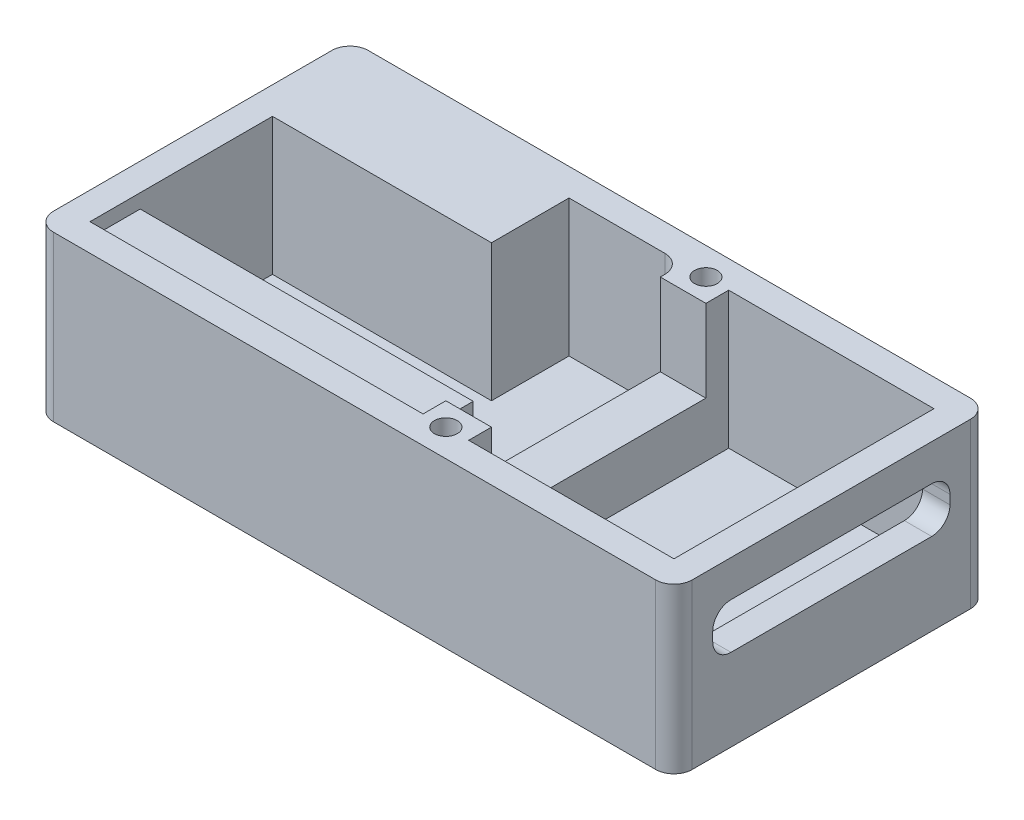
ISO-10303-21;
HEADER;
FILE_DESCRIPTION(('STEP AP214'),'2;1');
FILE_NAME('part.step','',(''),(''),'','','');
FILE_SCHEMA(('AUTOMOTIVE_DESIGN { 1 0 10303 214 1 1 1 1 }'));
ENDSEC;
DATA;
#1=APPLICATION_CONTEXT('core data for automotive mechanical design processes');
#2=APPLICATION_PROTOCOL_DEFINITION('international standard','automotive_design',2000,#1);
#3=PRODUCT_CONTEXT('',#1,'mechanical');
#4=PRODUCT('Part','Part','',(#3));
#5=PRODUCT_RELATED_PRODUCT_CATEGORY('part','',(#4));
#6=PRODUCT_DEFINITION_FORMATION('','',#4);
#7=PRODUCT_DEFINITION_CONTEXT('part definition',#1,'design');
#8=PRODUCT_DEFINITION('design','',#6,#7);
#9=PRODUCT_DEFINITION_SHAPE('','',#8);
#10=(LENGTH_UNIT() NAMED_UNIT(*) SI_UNIT(.MILLI.,.METRE.));
#11=(NAMED_UNIT(*) PLANE_ANGLE_UNIT() SI_UNIT($,.RADIAN.));
#12=(NAMED_UNIT(*) SI_UNIT($,.STERADIAN.) SOLID_ANGLE_UNIT());
#13=UNCERTAINTY_MEASURE_WITH_UNIT(LENGTH_MEASURE(1.E-05),#10,'distance_accuracy_value','');
#14=(GEOMETRIC_REPRESENTATION_CONTEXT(3) GLOBAL_UNCERTAINTY_ASSIGNED_CONTEXT((#13)) GLOBAL_UNIT_ASSIGNED_CONTEXT((#10,
#11,#12)) REPRESENTATION_CONTEXT('',''));
#15=CARTESIAN_POINT('',(0.,0.,0.));
#16=DIRECTION('',(0.,0.,1.));
#17=DIRECTION('',(1.,0.,0.));
#18=AXIS2_PLACEMENT_3D('',#15,#16,#17);
#19=CARTESIAN_POINT('',(4.5,46.9352725924606,-14.25));
#20=DIRECTION('',(1.,0.,0.));
#21=DIRECTION('',(0.,0.,-1.));
#22=AXIS2_PLACEMENT_3D('',#19,#20,#21);
#23=PLANE('',#22);
#24=DIRECTION('',(0.,0.,1.));
#25=VECTOR('',#24,1.);
#26=CARTESIAN_POINT('',(4.5,18.,-14.25));
#27=LINE('',#26,#25);
#28=CARTESIAN_POINT('',(4.5,18.,11.75));
#29=VERTEX_POINT('',#28);
#30=CARTESIAN_POINT('',(4.5,18.,14.25));
#31=VERTEX_POINT('',#30);
#32=EDGE_CURVE('E371',#29,#31,#27,.T.);
#33=ORIENTED_EDGE('',*,*,#32,.F.);
#34=DIRECTION('',(0.,1.,0.));
#35=VECTOR('',#34,1.);
#36=CARTESIAN_POINT('',(4.5,-15.0260275534679,11.75));
#37=LINE('',#36,#35);
#38=CARTESIAN_POINT('',(4.5,16.45,11.75));
#39=VERTEX_POINT('',#38);
#40=EDGE_CURVE('E318',#39,#29,#37,.T.);
#41=ORIENTED_EDGE('',*,*,#40,.F.);
#42=DIRECTION('',(0.,0.,-1.));
#43=VECTOR('',#42,1.);
#44=CARTESIAN_POINT('',(4.5,16.45,14.25));
#45=LINE('',#44,#43);
#46=CARTESIAN_POINT('',(4.5,16.45,14.25));
#47=VERTEX_POINT('',#46);
#48=EDGE_CURVE('E323',#47,#39,#45,.T.);
#49=ORIENTED_EDGE('',*,*,#48,.F.);
#50=DIRECTION('',(0.,-1.,0.));
#51=VECTOR('',#50,1.);
#52=CARTESIAN_POINT('',(4.5,46.9352725924606,14.25));
#53=LINE('',#52,#51);
#54=EDGE_CURVE('E367',#31,#47,#53,.T.);
#55=ORIENTED_EDGE('',*,*,#54,.F.);
#56=EDGE_LOOP('',(#33,#41,#49,#55));
#57=FACE_BOUND('',#56,.T.);
#58=ADVANCED_FACE('F61',(#57),#23,.F.);
#59=CARTESIAN_POINT('',(0.,3.,0.));
#60=DIRECTION('',(0.,-1.,0.));
#61=DIRECTION('',(0.,0.,-1.));
#62=AXIS2_PLACEMENT_3D('',#59,#60,#61);
#63=PLANE('',#62);
#64=DIRECTION('',(0.,0.,1.));
#65=VECTOR('',#64,1.);
#66=CARTESIAN_POINT('',(4.5,3.,-14.25));
#67=LINE('',#66,#65);
#68=CARTESIAN_POINT('',(4.5,3.,-12.25));
#69=VERTEX_POINT('',#68);
#70=CARTESIAN_POINT('',(4.5,3.,8.75));
#71=VERTEX_POINT('',#70);
#72=EDGE_CURVE('E365',#69,#71,#67,.T.);
#73=ORIENTED_EDGE('',*,*,#72,.F.);
#74=CARTESIAN_POINT('',(2.5,3.,-12.25));
#75=DIRECTION('',(0.,-1.,0.));
#76=DIRECTION('',(0.,0.,-1.));
#77=AXIS2_PLACEMENT_3D('',#74,#75,#76);
#78=CIRCLE('',#77,2.);
#79=CARTESIAN_POINT('',(2.5,3.,-14.25));
#80=VERTEX_POINT('',#79);
#81=EDGE_CURVE('E83',#69,#80,#78,.F.);
#82=ORIENTED_EDGE('',*,*,#81,.T.);
#83=DIRECTION('',(-1.,0.,0.));
#84=VECTOR('',#83,1.);
#85=CARTESIAN_POINT('',(35.,3.,-14.25));
#86=LINE('',#85,#84);
#87=CARTESIAN_POINT('',(-8.,3.,-14.25));
#88=VERTEX_POINT('',#87);
#89=EDGE_CURVE('E421',#80,#88,#86,.T.);
#90=ORIENTED_EDGE('',*,*,#89,.T.);
#91=DIRECTION('',(0.,0.,-1.));
#92=VECTOR('',#91,1.);
#93=CARTESIAN_POINT('',(-8.,3.,-14.25));
#94=LINE('',#93,#92);
#95=CARTESIAN_POINT('',(-8.,3.,-5.75));
#96=VERTEX_POINT('',#95);
#97=EDGE_CURVE('E339',#96,#88,#94,.T.);
#98=ORIENTED_EDGE('',*,*,#97,.F.);
#99=DIRECTION('',(1.,0.,0.));
#100=VECTOR('',#99,1.);
#101=CARTESIAN_POINT('',(-32.,3.,-5.75));
#102=LINE('',#101,#100);
#103=CARTESIAN_POINT('',(-32.,3.,-5.75));
#104=VERTEX_POINT('',#103);
#105=EDGE_CURVE('E344',#104,#96,#102,.T.);
#106=ORIENTED_EDGE('',*,*,#105,.F.);
#107=DIRECTION('',(0.,0.,1.));
#108=VECTOR('',#107,1.);
#109=CARTESIAN_POINT('',(-32.,3.,-17.25));
#110=LINE('',#109,#108);
#111=CARTESIAN_POINT('',(-32.,3.,8.75));
#112=VERTEX_POINT('',#111);
#113=EDGE_CURVE('E424',#104,#112,#110,.T.);
#114=ORIENTED_EDGE('',*,*,#113,.T.);
#115=DIRECTION('',(-1.,0.,0.));
#116=VECTOR('',#115,1.);
#117=CARTESIAN_POINT('',(-32.,3.,8.75));
#118=LINE('',#117,#116);
#119=EDGE_CURVE('E319',#71,#112,#118,.T.);
#120=ORIENTED_EDGE('',*,*,#119,.F.);
#121=EDGE_LOOP('',(#73,#82,#90,#98,#106,#114,#120));
#122=FACE_BOUND('',#121,.T.);
#123=ADVANCED_FACE('F542',(#122),#63,.F.);
#124=CARTESIAN_POINT('',(-32.,18.,-17.25));
#125=DIRECTION('',(1.,0.,0.));
#126=DIRECTION('',(0.,0.,-1.));
#127=AXIS2_PLACEMENT_3D('',#124,#125,#126);
#128=PLANE('',#127);
#129=DIRECTION('',(0.,0.,1.));
#130=VECTOR('',#129,1.);
#131=CARTESIAN_POINT('',(-32.,16.45,14.25));
#132=LINE('',#131,#130);
#133=CARTESIAN_POINT('',(-32.,16.45,8.75));
#134=VERTEX_POINT('',#133);
#135=CARTESIAN_POINT('',(-32.,16.45,14.25));
#136=VERTEX_POINT('',#135);
#137=EDGE_CURVE('E330',#134,#136,#132,.T.);
#138=ORIENTED_EDGE('',*,*,#137,.F.);
#139=DIRECTION('',(0.,-1.,0.));
#140=VECTOR('',#139,1.);
#141=CARTESIAN_POINT('',(-32.,54.9120576505835,8.75));
#142=LINE('',#141,#140);
#143=EDGE_CURVE('E317',#134,#112,#142,.T.);
#144=ORIENTED_EDGE('',*,*,#143,.T.);
#145=ORIENTED_EDGE('',*,*,#113,.F.);
#146=DIRECTION('',(0.,-1.,0.));
#147=VECTOR('',#146,1.);
#148=CARTESIAN_POINT('',(-32.,43.460754112948,-5.75));
#149=LINE('',#148,#147);
#150=CARTESIAN_POINT('',(-32.,18.,-5.75));
#151=VERTEX_POINT('',#150);
#152=EDGE_CURVE('E326',#151,#104,#149,.T.);
#153=ORIENTED_EDGE('',*,*,#152,.F.);
#154=DIRECTION('',(0.,0.,1.));
#155=VECTOR('',#154,1.);
#156=CARTESIAN_POINT('',(-32.,18.,-17.25));
#157=LINE('',#156,#155);
#158=CARTESIAN_POINT('',(-32.,18.,14.25));
#159=VERTEX_POINT('',#158);
#160=EDGE_CURVE('E414',#151,#159,#157,.T.);
#161=ORIENTED_EDGE('',*,*,#160,.T.);
#162=DIRECTION('',(0.,-1.,0.));
#163=VECTOR('',#162,1.);
#164=CARTESIAN_POINT('',(-32.,18.,14.25));
#165=LINE('',#164,#163);
#166=EDGE_CURVE('E416',#159,#136,#165,.T.);
#167=ORIENTED_EDGE('',*,*,#166,.T.);
#168=EDGE_LOOP('',(#138,#144,#145,#153,#161,#167));
#169=FACE_BOUND('',#168,.T.);
#170=ADVANCED_FACE('F549',(#169),#128,.T.);
#171=CARTESIAN_POINT('',(4.5,18.,-12.25));
#172=VERTEX_POINT('',#171);
#173=CARTESIAN_POINT('',(4.5,18.,-11.75));
#174=VERTEX_POINT('',#173);
#175=EDGE_CURVE('E368',#172,#174,#27,.T.);
#176=ORIENTED_EDGE('',*,*,#175,.F.);
#177=DIRECTION('',(0.,-1.,0.));
#178=VECTOR('',#177,1.);
#179=CARTESIAN_POINT('',(4.5,46.9352725924606,-12.25));
#180=LINE('',#179,#178);
#181=EDGE_CURVE('E530',#172,#69,#180,.T.);
#182=ORIENTED_EDGE('',*,*,#181,.T.);
#183=ORIENTED_EDGE('',*,*,#72,.T.);
#184=DIRECTION('',(0.,-1.,0.));
#185=VECTOR('',#184,1.);
#186=CARTESIAN_POINT('',(4.5,54.9120576505835,8.75));
#187=LINE('',#186,#185);
#188=CARTESIAN_POINT('',(4.5,9.,8.75));
#189=VERTEX_POINT('',#188);
#190=EDGE_CURVE('E336',#189,#71,#187,.T.);
#191=ORIENTED_EDGE('',*,*,#190,.F.);
#192=DIRECTION('',(0.,0.,1.));
#193=VECTOR('',#192,1.);
#194=CARTESIAN_POINT('',(4.5,9.,-11.75));
#195=LINE('',#194,#193);
#196=CARTESIAN_POINT('',(4.5,9.,-11.75));
#197=VERTEX_POINT('',#196);
#198=EDGE_CURVE('E566',#197,#189,#195,.T.);
#199=ORIENTED_EDGE('',*,*,#198,.F.);
#200=DIRECTION('',(0.,1.,0.));
#201=VECTOR('',#200,1.);
#202=CARTESIAN_POINT('',(4.5,-15.0260275534679,-11.75));
#203=LINE('',#202,#201);
#204=EDGE_CURVE('E312',#197,#174,#203,.T.);
#205=ORIENTED_EDGE('',*,*,#204,.T.);
#206=EDGE_LOOP('',(#176,#182,#183,#191,#199,#205));
#207=FACE_BOUND('',#206,.T.);
#208=ADVANCED_FACE('F536',(#207),#23,.F.);
#209=CARTESIAN_POINT('',(35.,18.,-14.25));
#210=DIRECTION('',(0.,0.,1.));
#211=DIRECTION('',(1.,0.,0.));
#212=AXIS2_PLACEMENT_3D('',#209,#210,#211);
#213=PLANE('',#212);
#214=ORIENTED_EDGE('',*,*,#89,.F.);
#215=DIRECTION('',(0.,-1.,0.));
#216=VECTOR('',#215,1.);
#217=CARTESIAN_POINT('',(2.5,18.,-14.25));
#218=LINE('',#217,#216);
#219=CARTESIAN_POINT('',(2.5,18.,-14.25));
#220=VERTEX_POINT('',#219);
#221=EDGE_CURVE('E69',#80,#220,#218,.F.);
#222=ORIENTED_EDGE('',*,*,#221,.T.);
#223=DIRECTION('',(-1.,0.,0.));
#224=VECTOR('',#223,1.);
#225=CARTESIAN_POINT('',(35.,18.,-14.25));
#226=LINE('',#225,#224);
#227=CARTESIAN_POINT('',(-8.,18.,-14.25));
#228=VERTEX_POINT('',#227);
#229=EDGE_CURVE('E410',#220,#228,#226,.T.);
#230=ORIENTED_EDGE('',*,*,#229,.T.);
#231=DIRECTION('',(0.,-1.,0.));
#232=VECTOR('',#231,1.);
#233=CARTESIAN_POINT('',(-8.,43.460754112948,-14.25));
#234=LINE('',#233,#232);
#235=EDGE_CURVE('E342',#228,#88,#234,.T.);
#236=ORIENTED_EDGE('',*,*,#235,.T.);
#237=EDGE_LOOP('',(#214,#222,#230,#236));
#238=FACE_BOUND('',#237,.T.);
#239=ADVANCED_FACE('F662',(#238),#213,.T.);
#240=CARTESIAN_POINT('',(-35.,18.,14.25));
#241=DIRECTION('',(0.,0.,-1.));
#242=DIRECTION('',(-1.,0.,0.));
#243=AXIS2_PLACEMENT_3D('',#240,#241,#242);
#244=PLANE('',#243);
#245=DIRECTION('',(1.,0.,0.));
#246=VECTOR('',#245,1.);
#247=CARTESIAN_POINT('',(-32.,16.45,14.25));
#248=LINE('',#247,#246);
#249=EDGE_CURVE('E328',#136,#47,#248,.T.);
#250=ORIENTED_EDGE('',*,*,#249,.F.);
#251=ORIENTED_EDGE('',*,*,#166,.F.);
#252=DIRECTION('',(1.,0.,0.));
#253=VECTOR('',#252,1.);
#254=CARTESIAN_POINT('',(-35.,18.,14.25));
#255=LINE('',#254,#253);
#256=EDGE_CURVE('E404',#159,#31,#255,.T.);
#257=ORIENTED_EDGE('',*,*,#256,.T.);
#258=ORIENTED_EDGE('',*,*,#54,.T.);
#259=EDGE_LOOP('',(#250,#251,#257,#258));
#260=FACE_BOUND('',#259,.T.);
#261=ADVANCED_FACE('F558',(#260),#244,.T.);
#262=DIRECTION('',(1.,0.,0.));
#263=VECTOR('',#262,1.);
#264=CARTESIAN_POINT('',(-35.,3.,14.25));
#265=LINE('',#264,#263);
#266=CARTESIAN_POINT('',(9.5,3.,14.25));
#267=VERTEX_POINT('',#266);
#268=CARTESIAN_POINT('',(32.,3.,14.25));
#269=VERTEX_POINT('',#268);
#270=EDGE_CURVE('E388',#267,#269,#265,.T.);
#271=ORIENTED_EDGE('',*,*,#270,.F.);
#272=DIRECTION('',(0.,-1.,0.));
#273=VECTOR('',#272,1.);
#274=CARTESIAN_POINT('',(9.5,46.9352725924606,14.25));
#275=LINE('',#274,#273);
#276=CARTESIAN_POINT('',(9.5,18.,14.25));
#277=VERTEX_POINT('',#276);
#278=EDGE_CURVE('E364',#277,#267,#275,.T.);
#279=ORIENTED_EDGE('',*,*,#278,.F.);
#280=CARTESIAN_POINT('',(32.,18.,14.25));
#281=VERTEX_POINT('',#280);
#282=EDGE_CURVE('E408',#277,#281,#255,.T.);
#283=ORIENTED_EDGE('',*,*,#282,.T.);
#284=DIRECTION('',(0.,-1.,0.));
#285=VECTOR('',#284,1.);
#286=CARTESIAN_POINT('',(32.,18.,14.25));
#287=LINE('',#286,#285);
#288=EDGE_CURVE('E431',#281,#269,#287,.T.);
#289=ORIENTED_EDGE('',*,*,#288,.T.);
#290=EDGE_LOOP('',(#271,#279,#283,#289));
#291=FACE_BOUND('',#290,.T.);
#292=ADVANCED_FACE('F679',(#291),#244,.T.);
#293=CARTESIAN_POINT('',(32.,18.,-14.25));
#294=VERTEX_POINT('',#293);
#295=CARTESIAN_POINT('',(9.5,18.,-14.25));
#296=VERTEX_POINT('',#295);
#297=EDGE_CURVE('E411',#294,#296,#226,.T.);
#298=ORIENTED_EDGE('',*,*,#297,.T.);
#299=DIRECTION('',(0.,-1.,0.));
#300=VECTOR('',#299,1.);
#301=CARTESIAN_POINT('',(9.5,46.9352725924606,-14.25));
#302=LINE('',#301,#300);
#303=CARTESIAN_POINT('',(9.5,3.,-14.25));
#304=VERTEX_POINT('',#303);
#305=EDGE_CURVE('E350',#296,#304,#302,.T.);
#306=ORIENTED_EDGE('',*,*,#305,.T.);
#307=CARTESIAN_POINT('',(32.,3.,-14.25));
#308=VERTEX_POINT('',#307);
#309=EDGE_CURVE('E422',#308,#304,#86,.T.);
#310=ORIENTED_EDGE('',*,*,#309,.F.);
#311=DIRECTION('',(0.,-1.,0.));
#312=VECTOR('',#311,1.);
#313=CARTESIAN_POINT('',(32.,18.,-14.25));
#314=LINE('',#313,#312);
#315=EDGE_CURVE('E429',#294,#308,#314,.T.);
#316=ORIENTED_EDGE('',*,*,#315,.F.);
#317=EDGE_LOOP('',(#298,#306,#310,#316));
#318=FACE_BOUND('',#317,.T.);
#319=ADVANCED_FACE('F649',(#318),#213,.T.);
#320=DIRECTION('',(0.,0.,-1.));
#321=VECTOR('',#320,1.);
#322=CARTESIAN_POINT('',(9.5,3.,14.25));
#323=LINE('',#322,#321);
#324=EDGE_CURVE('E360',#267,#304,#323,.T.);
#325=ORIENTED_EDGE('',*,*,#324,.F.);
#326=ORIENTED_EDGE('',*,*,#270,.T.);
#327=DIRECTION('',(0.,0.,-1.));
#328=VECTOR('',#327,1.);
#329=CARTESIAN_POINT('',(32.,3.,17.25));
#330=LINE('',#329,#328);
#331=EDGE_CURVE('E418',#269,#308,#330,.T.);
#332=ORIENTED_EDGE('',*,*,#331,.T.);
#333=ORIENTED_EDGE('',*,*,#309,.T.);
#334=EDGE_LOOP('',(#325,#326,#332,#333));
#335=FACE_BOUND('',#334,.T.);
#336=ADVANCED_FACE('F641',(#335),#63,.F.);
#337=CARTESIAN_POINT('',(35.,3.,17.25));
#338=DIRECTION('',(-1.,0.,0.));
#339=DIRECTION('',(0.,0.,1.));
#340=AXIS2_PLACEMENT_3D('',#337,#338,#339);
#341=PLANE('',#340);
#342=DIRECTION('',(0.,0.,-1.));
#343=VECTOR('',#342,1.);
#344=CARTESIAN_POINT('',(35.,9.,13.));
#345=LINE('',#344,#343);
#346=CARTESIAN_POINT('',(35.,9.,11.));
#347=VERTEX_POINT('',#346);
#348=CARTESIAN_POINT('',(35.,9.,-11.));
#349=VERTEX_POINT('',#348);
#350=EDGE_CURVE('E392',#347,#349,#345,.T.);
#351=ORIENTED_EDGE('',*,*,#350,.F.);
#352=CARTESIAN_POINT('',(35.,11.,11.));
#353=DIRECTION('',(-1.,0.,0.));
#354=DIRECTION('',(0.,0.,1.));
#355=AXIS2_PLACEMENT_3D('',#352,#353,#354);
#356=CIRCLE('',#355,2.);
#357=CARTESIAN_POINT('',(35.,11.,13.));
#358=VERTEX_POINT('',#357);
#359=EDGE_CURVE('E478',#347,#358,#356,.T.);
#360=ORIENTED_EDGE('',*,*,#359,.T.);
#361=DIRECTION('',(0.,-1.,0.));
#362=VECTOR('',#361,1.);
#363=CARTESIAN_POINT('',(35.,9.,13.));
#364=LINE('',#363,#362);
#365=CARTESIAN_POINT('',(35.,12.,13.));
#366=VERTEX_POINT('',#365);
#367=EDGE_CURVE('E383',#366,#358,#364,.T.);
#368=ORIENTED_EDGE('',*,*,#367,.F.);
#369=CARTESIAN_POINT('',(35.,12.,11.));
#370=DIRECTION('',(-1.,0.,0.));
#371=DIRECTION('',(0.,0.,1.));
#372=AXIS2_PLACEMENT_3D('',#369,#370,#371);
#373=CIRCLE('',#372,2.);
#374=CARTESIAN_POINT('',(35.,14.,11.));
#375=VERTEX_POINT('',#374);
#376=EDGE_CURVE('E482',#366,#375,#373,.T.);
#377=ORIENTED_EDGE('',*,*,#376,.T.);
#378=DIRECTION('',(0.,0.,1.));
#379=VECTOR('',#378,1.);
#380=CARTESIAN_POINT('',(35.,14.,13.));
#381=LINE('',#380,#379);
#382=CARTESIAN_POINT('',(35.,14.,-11.));
#383=VERTEX_POINT('',#382);
#384=EDGE_CURVE('E385',#383,#375,#381,.T.);
#385=ORIENTED_EDGE('',*,*,#384,.F.);
#386=CARTESIAN_POINT('',(35.,12.,-11.));
#387=DIRECTION('',(-1.,0.,0.));
#388=DIRECTION('',(0.,0.,1.));
#389=AXIS2_PLACEMENT_3D('',#386,#387,#388);
#390=CIRCLE('',#389,2.);
#391=CARTESIAN_POINT('',(35.,12.,-13.));
#392=VERTEX_POINT('',#391);
#393=EDGE_CURVE('E486',#383,#392,#390,.T.);
#394=ORIENTED_EDGE('',*,*,#393,.T.);
#395=DIRECTION('',(0.,1.,0.));
#396=VECTOR('',#395,1.);
#397=CARTESIAN_POINT('',(35.,9.,-13.));
#398=LINE('',#397,#396);
#399=CARTESIAN_POINT('',(35.,11.,-13.));
#400=VERTEX_POINT('',#399);
#401=EDGE_CURVE('E389',#400,#392,#398,.T.);
#402=ORIENTED_EDGE('',*,*,#401,.F.);
#403=CARTESIAN_POINT('',(35.,11.,-11.));
#404=DIRECTION('',(-1.,0.,0.));
#405=DIRECTION('',(0.,0.,1.));
#406=AXIS2_PLACEMENT_3D('',#403,#404,#405);
#407=CIRCLE('',#406,2.);
#408=EDGE_CURVE('E490',#400,#349,#407,.T.);
#409=ORIENTED_EDGE('',*,*,#408,.T.);
#410=EDGE_LOOP('',(#351,#360,#368,#377,#385,#394,#402,#409));
#411=FACE_BOUND('',#410,.T.);
#412=DIRECTION('',(0.,0.,-1.));
#413=VECTOR('',#412,1.);
#414=CARTESIAN_POINT('',(35.,0.,17.25));
#415=LINE('',#414,#413);
#416=CARTESIAN_POINT('',(35.,0.,15.25));
#417=VERTEX_POINT('',#416);
#418=CARTESIAN_POINT('',(35.,0.,-15.25));
#419=VERTEX_POINT('',#418);
#420=EDGE_CURVE('E446',#417,#419,#415,.T.);
#421=ORIENTED_EDGE('',*,*,#420,.T.);
#422=DIRECTION('',(0.,-1.,0.));
#423=VECTOR('',#422,1.);
#424=CARTESIAN_POINT('',(35.,3.,-15.25));
#425=LINE('',#424,#423);
#426=CARTESIAN_POINT('',(35.,18.,-15.25));
#427=VERTEX_POINT('',#426);
#428=EDGE_CURVE('E510',#419,#427,#425,.F.);
#429=ORIENTED_EDGE('',*,*,#428,.T.);
#430=DIRECTION('',(0.,0.,-1.));
#431=VECTOR('',#430,1.);
#432=CARTESIAN_POINT('',(35.,18.,17.25));
#433=LINE('',#432,#431);
#434=CARTESIAN_POINT('',(35.,18.,15.25));
#435=VERTEX_POINT('',#434);
#436=EDGE_CURVE('E437',#435,#427,#433,.T.);
#437=ORIENTED_EDGE('',*,*,#436,.F.);
#438=DIRECTION('',(0.,-1.,0.));
#439=VECTOR('',#438,1.);
#440=CARTESIAN_POINT('',(35.,3.,15.25));
#441=LINE('',#440,#439);
#442=EDGE_CURVE('E507',#435,#417,#441,.T.);
#443=ORIENTED_EDGE('',*,*,#442,.T.);
#444=EDGE_LOOP('',(#421,#429,#437,#443));
#445=FACE_BOUND('',#444,.T.);
#446=ADVANCED_FACE('F639',(#411,#445),#341,.F.);
#447=CARTESIAN_POINT('',(-35.,3.,-17.25));
#448=DIRECTION('',(0.,0.,1.));
#449=DIRECTION('',(1.,0.,0.));
#450=AXIS2_PLACEMENT_3D('',#447,#448,#449);
#451=PLANE('',#450);
#452=DIRECTION('',(-1.,0.,0.));
#453=VECTOR('',#452,1.);
#454=CARTESIAN_POINT('',(35.,18.,-17.25));
#455=LINE('',#454,#453);
#456=CARTESIAN_POINT('',(33.,18.,-17.25));
#457=VERTEX_POINT('',#456);
#458=CARTESIAN_POINT('',(-33.,18.,-17.25));
#459=VERTEX_POINT('',#458);
#460=EDGE_CURVE('E440',#457,#459,#455,.T.);
#461=ORIENTED_EDGE('',*,*,#460,.F.);
#462=DIRECTION('',(0.,-1.,0.));
#463=VECTOR('',#462,1.);
#464=CARTESIAN_POINT('',(33.,3.,-17.25));
#465=LINE('',#464,#463);
#466=CARTESIAN_POINT('',(33.,0.,-17.25));
#467=VERTEX_POINT('',#466);
#468=EDGE_CURVE('E496',#457,#467,#465,.T.);
#469=ORIENTED_EDGE('',*,*,#468,.T.);
#470=DIRECTION('',(-1.,0.,0.));
#471=VECTOR('',#470,1.);
#472=CARTESIAN_POINT('',(-35.,0.,-17.25));
#473=LINE('',#472,#471);
#474=CARTESIAN_POINT('',(-33.,0.,-17.25));
#475=VERTEX_POINT('',#474);
#476=EDGE_CURVE('E449',#467,#475,#473,.T.);
#477=ORIENTED_EDGE('',*,*,#476,.T.);
#478=DIRECTION('',(0.,-1.,0.));
#479=VECTOR('',#478,1.);
#480=CARTESIAN_POINT('',(-33.,3.,-17.25));
#481=LINE('',#480,#479);
#482=EDGE_CURVE('E494',#475,#459,#481,.F.);
#483=ORIENTED_EDGE('',*,*,#482,.T.);
#484=EDGE_LOOP('',(#461,#469,#477,#483));
#485=FACE_BOUND('',#484,.T.);
#486=ADVANCED_FACE('F615',(#485),#451,.F.);
#487=CARTESIAN_POINT('',(-35.,3.,17.25));
#488=DIRECTION('',(1.,0.,0.));
#489=DIRECTION('',(0.,0.,-1.));
#490=AXIS2_PLACEMENT_3D('',#487,#488,#489);
#491=PLANE('',#490);
#492=DIRECTION('',(0.,0.,1.));
#493=VECTOR('',#492,1.);
#494=CARTESIAN_POINT('',(-35.,18.,-17.25));
#495=LINE('',#494,#493);
#496=CARTESIAN_POINT('',(-35.,18.,-15.25));
#497=VERTEX_POINT('',#496);
#498=CARTESIAN_POINT('',(-35.,18.,15.25));
#499=VERTEX_POINT('',#498);
#500=EDGE_CURVE('E443',#497,#499,#495,.T.);
#501=ORIENTED_EDGE('',*,*,#500,.F.);
#502=DIRECTION('',(0.,-1.,0.));
#503=VECTOR('',#502,1.);
#504=CARTESIAN_POINT('',(-35.,3.,-15.25));
#505=LINE('',#504,#503);
#506=CARTESIAN_POINT('',(-35.,0.,-15.25));
#507=VERTEX_POINT('',#506);
#508=EDGE_CURVE('E522',#497,#507,#505,.T.);
#509=ORIENTED_EDGE('',*,*,#508,.T.);
#510=DIRECTION('',(0.,0.,1.));
#511=VECTOR('',#510,1.);
#512=CARTESIAN_POINT('',(-35.,0.,17.25));
#513=LINE('',#512,#511);
#514=CARTESIAN_POINT('',(-35.,0.,15.25));
#515=VERTEX_POINT('',#514);
#516=EDGE_CURVE('E452',#507,#515,#513,.T.);
#517=ORIENTED_EDGE('',*,*,#516,.T.);
#518=DIRECTION('',(0.,-1.,0.));
#519=VECTOR('',#518,1.);
#520=CARTESIAN_POINT('',(-35.,3.,15.25));
#521=LINE('',#520,#519);
#522=EDGE_CURVE('E520',#515,#499,#521,.F.);
#523=ORIENTED_EDGE('',*,*,#522,.T.);
#524=EDGE_LOOP('',(#501,#509,#517,#523));
#525=FACE_BOUND('',#524,.T.);
#526=ADVANCED_FACE('F626',(#525),#491,.F.);
#527=CARTESIAN_POINT('',(-35.,3.,17.25));
#528=DIRECTION('',(0.,0.,-1.));
#529=DIRECTION('',(-1.,0.,0.));
#530=AXIS2_PLACEMENT_3D('',#527,#528,#529);
#531=PLANE('',#530);
#532=DIRECTION('',(1.,0.,0.));
#533=VECTOR('',#532,1.);
#534=CARTESIAN_POINT('',(-35.,18.,17.25));
#535=LINE('',#534,#533);
#536=CARTESIAN_POINT('',(-33.,18.,17.25));
#537=VERTEX_POINT('',#536);
#538=CARTESIAN_POINT('',(33.,18.,17.25));
#539=VERTEX_POINT('',#538);
#540=EDGE_CURVE('E434',#537,#539,#535,.T.);
#541=ORIENTED_EDGE('',*,*,#540,.F.);
#542=DIRECTION('',(0.,-1.,0.));
#543=VECTOR('',#542,1.);
#544=CARTESIAN_POINT('',(-33.,3.,17.25));
#545=LINE('',#544,#543);
#546=CARTESIAN_POINT('',(-33.,0.,17.25));
#547=VERTEX_POINT('',#546);
#548=EDGE_CURVE('E527',#537,#547,#545,.T.);
#549=ORIENTED_EDGE('',*,*,#548,.T.);
#550=DIRECTION('',(1.,0.,0.));
#551=VECTOR('',#550,1.);
#552=CARTESIAN_POINT('',(-35.,0.,17.25));
#553=LINE('',#552,#551);
#554=CARTESIAN_POINT('',(33.,0.,17.25));
#555=VERTEX_POINT('',#554);
#556=EDGE_CURVE('E455',#547,#555,#553,.T.);
#557=ORIENTED_EDGE('',*,*,#556,.T.);
#558=DIRECTION('',(0.,-1.,0.));
#559=VECTOR('',#558,1.);
#560=CARTESIAN_POINT('',(33.,3.,17.25));
#561=LINE('',#560,#559);
#562=EDGE_CURVE('E525',#555,#539,#561,.F.);
#563=ORIENTED_EDGE('',*,*,#562,.T.);
#564=EDGE_LOOP('',(#541,#549,#557,#563));
#565=FACE_BOUND('',#564,.T.);
#566=ADVANCED_FACE('F635',(#565),#531,.F.);
#567=CARTESIAN_POINT('',(0.,0.,0.));
#568=DIRECTION('',(0.,-1.,0.));
#569=DIRECTION('',(0.,0.,-1.));
#570=AXIS2_PLACEMENT_3D('',#567,#568,#569);
#571=PLANE('',#570);
#572=ORIENTED_EDGE('',*,*,#476,.F.);
#573=CARTESIAN_POINT('',(33.,0.,-15.25));
#574=DIRECTION('',(0.,-1.,0.));
#575=DIRECTION('',(0.,0.,-1.));
#576=AXIS2_PLACEMENT_3D('',#573,#574,#575);
#577=CIRCLE('',#576,2.);
#578=EDGE_CURVE('E505',#467,#419,#577,.T.);
#579=ORIENTED_EDGE('',*,*,#578,.T.);
#580=ORIENTED_EDGE('',*,*,#420,.F.);
#581=CARTESIAN_POINT('',(33.,0.,15.25));
#582=DIRECTION('',(0.,-1.,0.));
#583=DIRECTION('',(0.,0.,-1.));
#584=AXIS2_PLACEMENT_3D('',#581,#582,#583);
#585=CIRCLE('',#584,2.);
#586=EDGE_CURVE('E499',#417,#555,#585,.T.);
#587=ORIENTED_EDGE('',*,*,#586,.T.);
#588=ORIENTED_EDGE('',*,*,#556,.F.);
#589=CARTESIAN_POINT('',(-33.,0.,15.25));
#590=DIRECTION('',(0.,-1.,0.));
#591=DIRECTION('',(0.,0.,-1.));
#592=AXIS2_PLACEMENT_3D('',#589,#590,#591);
#593=CIRCLE('',#592,2.);
#594=EDGE_CURVE('E501',#547,#515,#593,.T.);
#595=ORIENTED_EDGE('',*,*,#594,.T.);
#596=ORIENTED_EDGE('',*,*,#516,.F.);
#597=CARTESIAN_POINT('',(-33.,0.,-15.25));
#598=DIRECTION('',(0.,-1.,0.));
#599=DIRECTION('',(0.,0.,-1.));
#600=AXIS2_PLACEMENT_3D('',#597,#598,#599);
#601=CIRCLE('',#600,2.);
#602=EDGE_CURVE('E503',#507,#475,#601,.T.);
#603=ORIENTED_EDGE('',*,*,#602,.T.);
#604=EDGE_LOOP('',(#572,#579,#580,#587,#588,#595,#596,#603));
#605=FACE_BOUND('',#604,.T.);
#606=ADVANCED_FACE('F598',(#605),#571,.T.);
#607=CARTESIAN_POINT('',(0.,18.,0.));
#608=DIRECTION('',(0.,1.,0.));
#609=DIRECTION('',(0.,0.,1.));
#610=AXIS2_PLACEMENT_3D('',#607,#608,#609);
#611=PLANE('',#610);
#612=CARTESIAN_POINT('',(7.,18.,-14.25));
#613=DIRECTION('',(0.,1.,0.));
#614=DIRECTION('',(0.,0.,1.));
#615=AXIS2_PLACEMENT_3D('',#612,#613,#614);
#616=CIRCLE('',#615,1.25);
#617=CARTESIAN_POINT('',(7.,18.,-13.));
#618=VERTEX_POINT('',#617);
#619=EDGE_CURVE('E579',#618,#618,#616,.T.);
#620=ORIENTED_EDGE('',*,*,#619,.F.);
#621=EDGE_LOOP('',(#620));
#622=FACE_BOUND('',#621,.T.);
#623=CARTESIAN_POINT('',(7.,18.,14.25));
#624=DIRECTION('',(0.,1.,0.));
#625=DIRECTION('',(0.,0.,-1.));
#626=AXIS2_PLACEMENT_3D('',#623,#624,#625);
#627=CIRCLE('',#626,1.25);
#628=CARTESIAN_POINT('',(7.,18.,13.));
#629=VERTEX_POINT('',#628);
#630=EDGE_CURVE('E573',#629,#629,#627,.T.);
#631=ORIENTED_EDGE('',*,*,#630,.F.);
#632=EDGE_LOOP('',(#631));
#633=FACE_BOUND('',#632,.T.);
#634=DIRECTION('',(1.,0.,0.));
#635=VECTOR('',#634,1.);
#636=CARTESIAN_POINT('',(4.5,18.,11.75));
#637=LINE('',#636,#635);
#638=CARTESIAN_POINT('',(9.5,18.,11.75));
#639=VERTEX_POINT('',#638);
#640=EDGE_CURVE('E287',#29,#639,#637,.T.);
#641=ORIENTED_EDGE('',*,*,#640,.F.);
#642=ORIENTED_EDGE('',*,*,#32,.T.);
#643=ORIENTED_EDGE('',*,*,#256,.F.);
#644=ORIENTED_EDGE('',*,*,#160,.F.);
#645=DIRECTION('',(1.,0.,0.));
#646=VECTOR('',#645,1.);
#647=CARTESIAN_POINT('',(-32.,18.,-5.75));
#648=LINE('',#647,#646);
#649=CARTESIAN_POINT('',(-8.,18.,-5.75));
#650=VERTEX_POINT('',#649);
#651=EDGE_CURVE('E351',#151,#650,#648,.T.);
#652=ORIENTED_EDGE('',*,*,#651,.T.);
#653=DIRECTION('',(0.,0.,-1.));
#654=VECTOR('',#653,1.);
#655=CARTESIAN_POINT('',(-8.,18.,-14.25));
#656=LINE('',#655,#654);
#657=EDGE_CURVE('E347',#650,#228,#656,.T.);
#658=ORIENTED_EDGE('',*,*,#657,.T.);
#659=ORIENTED_EDGE('',*,*,#229,.F.);
#660=CARTESIAN_POINT('',(2.5,18.,-12.25));
#661=DIRECTION('',(0.,1.,0.));
#662=DIRECTION('',(0.,0.,1.));
#663=AXIS2_PLACEMENT_3D('',#660,#661,#662);
#664=CIRCLE('',#663,2.);
#665=EDGE_CURVE('E13',#220,#172,#664,.F.);
#666=ORIENTED_EDGE('',*,*,#665,.T.);
#667=ORIENTED_EDGE('',*,*,#175,.T.);
#668=DIRECTION('',(-1.,0.,0.));
#669=VECTOR('',#668,1.);
#670=CARTESIAN_POINT('',(4.5,18.,-11.75));
#671=LINE('',#670,#669);
#672=CARTESIAN_POINT('',(9.5,18.,-11.75));
#673=VERTEX_POINT('',#672);
#674=EDGE_CURVE('E301',#673,#174,#671,.T.);
#675=ORIENTED_EDGE('',*,*,#674,.F.);
#676=DIRECTION('',(0.,0.,-1.));
#677=VECTOR('',#676,1.);
#678=CARTESIAN_POINT('',(9.5,18.,14.25));
#679=LINE('',#678,#677);
#680=EDGE_CURVE('E363',#673,#296,#679,.T.);
#681=ORIENTED_EDGE('',*,*,#680,.T.);
#682=ORIENTED_EDGE('',*,*,#297,.F.);
#683=DIRECTION('',(0.,0.,-1.));
#684=VECTOR('',#683,1.);
#685=CARTESIAN_POINT('',(32.,18.,17.25));
#686=LINE('',#685,#684);
#687=EDGE_CURVE('E407',#281,#294,#686,.T.);
#688=ORIENTED_EDGE('',*,*,#687,.F.);
#689=ORIENTED_EDGE('',*,*,#282,.F.);
#690=EDGE_CURVE('E372',#277,#639,#679,.T.);
#691=ORIENTED_EDGE('',*,*,#690,.T.);
#692=EDGE_LOOP('',(#641,#642,#643,#644,#652,#658,#659,#666,#667,#675,#681,#682,#688,#689,#691));
#693=FACE_BOUND('',#692,.T.);
#694=ORIENTED_EDGE('',*,*,#436,.T.);
#695=CARTESIAN_POINT('',(33.,18.,-15.25));
#696=DIRECTION('',(0.,1.,0.));
#697=DIRECTION('',(0.,0.,1.));
#698=AXIS2_PLACEMENT_3D('',#695,#696,#697);
#699=CIRCLE('',#698,2.);
#700=EDGE_CURVE('E518',#427,#457,#699,.T.);
#701=ORIENTED_EDGE('',*,*,#700,.T.);
#702=ORIENTED_EDGE('',*,*,#460,.T.);
#703=CARTESIAN_POINT('',(-33.,18.,-15.25));
#704=DIRECTION('',(0.,1.,0.));
#705=DIRECTION('',(0.,0.,1.));
#706=AXIS2_PLACEMENT_3D('',#703,#704,#705);
#707=CIRCLE('',#706,2.);
#708=EDGE_CURVE('E516',#459,#497,#707,.T.);
#709=ORIENTED_EDGE('',*,*,#708,.T.);
#710=ORIENTED_EDGE('',*,*,#500,.T.);
#711=CARTESIAN_POINT('',(-33.,18.,15.25));
#712=DIRECTION('',(0.,1.,0.));
#713=DIRECTION('',(0.,0.,1.));
#714=AXIS2_PLACEMENT_3D('',#711,#712,#713);
#715=CIRCLE('',#714,2.);
#716=EDGE_CURVE('E514',#499,#537,#715,.T.);
#717=ORIENTED_EDGE('',*,*,#716,.T.);
#718=ORIENTED_EDGE('',*,*,#540,.T.);
#719=CARTESIAN_POINT('',(33.,18.,15.25));
#720=DIRECTION('',(0.,1.,0.));
#721=DIRECTION('',(0.,0.,1.));
#722=AXIS2_PLACEMENT_3D('',#719,#720,#721);
#723=CIRCLE('',#722,2.);
#724=EDGE_CURVE('E512',#539,#435,#723,.T.);
#725=ORIENTED_EDGE('',*,*,#724,.T.);
#726=EDGE_LOOP('',(#694,#701,#702,#709,#710,#717,#718,#725));
#727=FACE_BOUND('',#726,.T.);
#728=ADVANCED_FACE('F594',(#622,#633,#693,#727),#611,.T.);
#729=CARTESIAN_POINT('',(32.,18.,17.25));
#730=DIRECTION('',(-1.,0.,0.));
#731=DIRECTION('',(0.,0.,1.));
#732=AXIS2_PLACEMENT_3D('',#729,#730,#731);
#733=PLANE('',#732);
#734=DIRECTION('',(0.,0.,1.));
#735=VECTOR('',#734,1.);
#736=CARTESIAN_POINT('',(32.,14.,13.));
#737=LINE('',#736,#735);
#738=CARTESIAN_POINT('',(32.,14.,-11.));
#739=VERTEX_POINT('',#738);
#740=CARTESIAN_POINT('',(32.,14.,11.));
#741=VERTEX_POINT('',#740);
#742=EDGE_CURVE('E399',#739,#741,#737,.T.);
#743=ORIENTED_EDGE('',*,*,#742,.T.);
#744=CARTESIAN_POINT('',(32.,12.,11.));
#745=DIRECTION('',(-1.,0.,0.));
#746=DIRECTION('',(0.,0.,1.));
#747=AXIS2_PLACEMENT_3D('',#744,#745,#746);
#748=CIRCLE('',#747,2.);
#749=CARTESIAN_POINT('',(32.,12.,13.));
#750=VERTEX_POINT('',#749);
#751=EDGE_CURVE('E484',#741,#750,#748,.F.);
#752=ORIENTED_EDGE('',*,*,#751,.T.);
#753=DIRECTION('',(0.,-1.,0.));
#754=VECTOR('',#753,1.);
#755=CARTESIAN_POINT('',(32.,9.,13.));
#756=LINE('',#755,#754);
#757=CARTESIAN_POINT('',(32.,11.,13.));
#758=VERTEX_POINT('',#757);
#759=EDGE_CURVE('E370',#750,#758,#756,.T.);
#760=ORIENTED_EDGE('',*,*,#759,.T.);
#761=CARTESIAN_POINT('',(32.,11.,11.));
#762=DIRECTION('',(-1.,0.,0.));
#763=DIRECTION('',(0.,0.,1.));
#764=AXIS2_PLACEMENT_3D('',#761,#762,#763);
#765=CIRCLE('',#764,2.);
#766=CARTESIAN_POINT('',(32.,9.,11.));
#767=VERTEX_POINT('',#766);
#768=EDGE_CURVE('E480',#758,#767,#765,.F.);
#769=ORIENTED_EDGE('',*,*,#768,.T.);
#770=DIRECTION('',(0.,0.,-1.));
#771=VECTOR('',#770,1.);
#772=CARTESIAN_POINT('',(32.,9.,13.));
#773=LINE('',#772,#771);
#774=CARTESIAN_POINT('',(32.,9.,-11.));
#775=VERTEX_POINT('',#774);
#776=EDGE_CURVE('E380',#767,#775,#773,.T.);
#777=ORIENTED_EDGE('',*,*,#776,.T.);
#778=CARTESIAN_POINT('',(32.,11.,-11.));
#779=DIRECTION('',(-1.,0.,0.));
#780=DIRECTION('',(0.,0.,1.));
#781=AXIS2_PLACEMENT_3D('',#778,#779,#780);
#782=CIRCLE('',#781,2.);
#783=CARTESIAN_POINT('',(32.,11.,-13.));
#784=VERTEX_POINT('',#783);
#785=EDGE_CURVE('E492',#775,#784,#782,.F.);
#786=ORIENTED_EDGE('',*,*,#785,.T.);
#787=DIRECTION('',(0.,1.,0.));
#788=VECTOR('',#787,1.);
#789=CARTESIAN_POINT('',(32.,9.,-13.));
#790=LINE('',#789,#788);
#791=CARTESIAN_POINT('',(32.,12.,-13.));
#792=VERTEX_POINT('',#791);
#793=EDGE_CURVE('E384',#784,#792,#790,.T.);
#794=ORIENTED_EDGE('',*,*,#793,.T.);
#795=CARTESIAN_POINT('',(32.,12.,-11.));
#796=DIRECTION('',(-1.,0.,0.));
#797=DIRECTION('',(0.,0.,1.));
#798=AXIS2_PLACEMENT_3D('',#795,#796,#797);
#799=CIRCLE('',#798,2.);
#800=EDGE_CURVE('E488',#792,#739,#799,.F.);
#801=ORIENTED_EDGE('',*,*,#800,.T.);
#802=EDGE_LOOP('',(#743,#752,#760,#769,#777,#786,#794,#801));
#803=FACE_BOUND('',#802,.T.);
#804=ORIENTED_EDGE('',*,*,#331,.F.);
#805=ORIENTED_EDGE('',*,*,#288,.F.);
#806=ORIENTED_EDGE('',*,*,#687,.T.);
#807=ORIENTED_EDGE('',*,*,#315,.T.);
#808=EDGE_LOOP('',(#804,#805,#806,#807));
#809=FACE_BOUND('',#808,.T.);
#810=ADVANCED_FACE('F597',(#803,#809),#733,.T.);
#811=CARTESIAN_POINT('',(-35.001,9.,13.));
#812=DIRECTION('',(0.,0.,1.));
#813=DIRECTION('',(1.,0.,0.));
#814=AXIS2_PLACEMENT_3D('',#811,#812,#813);
#815=PLANE('',#814);
#816=ORIENTED_EDGE('',*,*,#367,.T.);
#817=DIRECTION('',(1.,0.,0.));
#818=VECTOR('',#817,1.);
#819=CARTESIAN_POINT('',(32.,11.,13.));
#820=LINE('',#819,#818);
#821=EDGE_CURVE('E466',#358,#758,#820,.F.);
#822=ORIENTED_EDGE('',*,*,#821,.T.);
#823=ORIENTED_EDGE('',*,*,#759,.F.);
#824=DIRECTION('',(1.,0.,0.));
#825=VECTOR('',#824,1.);
#826=CARTESIAN_POINT('',(35.,12.,13.));
#827=LINE('',#826,#825);
#828=EDGE_CURVE('E463',#750,#366,#827,.T.);
#829=ORIENTED_EDGE('',*,*,#828,.T.);
#830=EDGE_LOOP('',(#816,#822,#823,#829));
#831=FACE_BOUND('',#830,.T.);
#832=ADVANCED_FACE('F672',(#831),#815,.F.);
#833=CARTESIAN_POINT('',(-35.001,14.,13.));
#834=DIRECTION('',(0.,1.,0.));
#835=DIRECTION('',(0.,0.,1.));
#836=AXIS2_PLACEMENT_3D('',#833,#834,#835);
#837=PLANE('',#836);
#838=ORIENTED_EDGE('',*,*,#384,.T.);
#839=DIRECTION('',(1.,0.,0.));
#840=VECTOR('',#839,1.);
#841=CARTESIAN_POINT('',(32.,14.,11.));
#842=LINE('',#841,#840);
#843=EDGE_CURVE('E471',#375,#741,#842,.F.);
#844=ORIENTED_EDGE('',*,*,#843,.T.);
#845=ORIENTED_EDGE('',*,*,#742,.F.);
#846=DIRECTION('',(1.,0.,0.));
#847=VECTOR('',#846,1.);
#848=CARTESIAN_POINT('',(35.,14.,-11.));
#849=LINE('',#848,#847);
#850=EDGE_CURVE('E468',#739,#383,#849,.T.);
#851=ORIENTED_EDGE('',*,*,#850,.T.);
#852=EDGE_LOOP('',(#838,#844,#845,#851));
#853=FACE_BOUND('',#852,.T.);
#854=ADVANCED_FACE('F716',(#853),#837,.F.);
#855=CARTESIAN_POINT('',(-35.001,9.,-13.));
#856=DIRECTION('',(0.,0.,-1.));
#857=DIRECTION('',(0.,1.,0.));
#858=AXIS2_PLACEMENT_3D('',#855,#856,#857);
#859=PLANE('',#858);
#860=ORIENTED_EDGE('',*,*,#401,.T.);
#861=DIRECTION('',(1.,0.,0.));
#862=VECTOR('',#861,1.);
#863=CARTESIAN_POINT('',(32.,12.,-13.));
#864=LINE('',#863,#862);
#865=EDGE_CURVE('E476',#392,#792,#864,.F.);
#866=ORIENTED_EDGE('',*,*,#865,.T.);
#867=ORIENTED_EDGE('',*,*,#793,.F.);
#868=DIRECTION('',(1.,0.,0.));
#869=VECTOR('',#868,1.);
#870=CARTESIAN_POINT('',(35.,11.,-13.));
#871=LINE('',#870,#869);
#872=EDGE_CURVE('E473',#784,#400,#871,.T.);
#873=ORIENTED_EDGE('',*,*,#872,.T.);
#874=EDGE_LOOP('',(#860,#866,#867,#873));
#875=FACE_BOUND('',#874,.T.);
#876=ADVANCED_FACE('F723',(#875),#859,.F.);
#877=CARTESIAN_POINT('',(-35.001,9.,13.));
#878=DIRECTION('',(0.,-1.,0.));
#879=DIRECTION('',(0.,0.,-1.));
#880=AXIS2_PLACEMENT_3D('',#877,#878,#879);
#881=PLANE('',#880);
#882=ORIENTED_EDGE('',*,*,#776,.F.);
#883=DIRECTION('',(1.,0.,0.));
#884=VECTOR('',#883,1.);
#885=CARTESIAN_POINT('',(35.,9.,11.));
#886=LINE('',#885,#884);
#887=EDGE_CURVE('E460',#767,#347,#886,.T.);
#888=ORIENTED_EDGE('',*,*,#887,.T.);
#889=ORIENTED_EDGE('',*,*,#350,.T.);
#890=DIRECTION('',(1.,0.,0.));
#891=VECTOR('',#890,1.);
#892=CARTESIAN_POINT('',(32.,9.,-11.));
#893=LINE('',#892,#891);
#894=EDGE_CURVE('E458',#349,#775,#893,.F.);
#895=ORIENTED_EDGE('',*,*,#894,.T.);
#896=EDGE_LOOP('',(#882,#888,#889,#895));
#897=FACE_BOUND('',#896,.T.);
#898=ADVANCED_FACE('F730',(#897),#881,.F.);
#899=CARTESIAN_POINT('',(9.5,46.9352725924606,14.25));
#900=DIRECTION('',(-1.,0.,0.));
#901=DIRECTION('',(0.,0.,1.));
#902=AXIS2_PLACEMENT_3D('',#899,#900,#901);
#903=PLANE('',#902);
#904=DIRECTION('',(0.,0.,-1.));
#905=VECTOR('',#904,1.);
#906=CARTESIAN_POINT('',(9.5,9.,-11.75));
#907=LINE('',#906,#905);
#908=CARTESIAN_POINT('',(9.5,9.,11.75));
#909=VERTEX_POINT('',#908);
#910=CARTESIAN_POINT('',(9.5,9.,-11.75));
#911=VERTEX_POINT('',#910);
#912=EDGE_CURVE('E292',#909,#911,#907,.T.);
#913=ORIENTED_EDGE('',*,*,#912,.F.);
#914=DIRECTION('',(0.,1.,0.));
#915=VECTOR('',#914,1.);
#916=CARTESIAN_POINT('',(9.5,-15.0260275534679,11.75));
#917=LINE('',#916,#915);
#918=EDGE_CURVE('E280',#909,#639,#917,.T.);
#919=ORIENTED_EDGE('',*,*,#918,.T.);
#920=ORIENTED_EDGE('',*,*,#690,.F.);
#921=ORIENTED_EDGE('',*,*,#278,.T.);
#922=ORIENTED_EDGE('',*,*,#324,.T.);
#923=ORIENTED_EDGE('',*,*,#305,.F.);
#924=ORIENTED_EDGE('',*,*,#680,.F.);
#925=DIRECTION('',(0.,1.,0.));
#926=VECTOR('',#925,1.);
#927=CARTESIAN_POINT('',(9.5,-15.0260275534679,-11.75));
#928=LINE('',#927,#926);
#929=EDGE_CURVE('E305',#911,#673,#928,.T.);
#930=ORIENTED_EDGE('',*,*,#929,.F.);
#931=EDGE_LOOP('',(#913,#919,#920,#921,#922,#923,#924,#930));
#932=FACE_BOUND('',#931,.T.);
#933=ADVANCED_FACE('F303',(#932),#903,.F.);
#934=CARTESIAN_POINT('',(-32.,43.460754112948,-5.75));
#935=DIRECTION('',(0.,0.,-1.));
#936=DIRECTION('',(-1.,0.,0.));
#937=AXIS2_PLACEMENT_3D('',#934,#935,#936);
#938=PLANE('',#937);
#939=ORIENTED_EDGE('',*,*,#651,.F.);
#940=ORIENTED_EDGE('',*,*,#152,.T.);
#941=ORIENTED_EDGE('',*,*,#105,.T.);
#942=DIRECTION('',(0.,-1.,0.));
#943=VECTOR('',#942,1.);
#944=CARTESIAN_POINT('',(-8.,43.460754112948,-5.75));
#945=LINE('',#944,#943);
#946=EDGE_CURVE('E343',#650,#96,#945,.T.);
#947=ORIENTED_EDGE('',*,*,#946,.F.);
#948=EDGE_LOOP('',(#939,#940,#941,#947));
#949=FACE_BOUND('',#948,.T.);
#950=ADVANCED_FACE('F745',(#949),#938,.F.);
#951=CARTESIAN_POINT('',(-8.,43.460754112948,-14.25));
#952=DIRECTION('',(-1.,0.,0.));
#953=DIRECTION('',(0.,0.,1.));
#954=AXIS2_PLACEMENT_3D('',#951,#952,#953);
#955=PLANE('',#954);
#956=ORIENTED_EDGE('',*,*,#657,.F.);
#957=ORIENTED_EDGE('',*,*,#946,.T.);
#958=ORIENTED_EDGE('',*,*,#97,.T.);
#959=ORIENTED_EDGE('',*,*,#235,.F.);
#960=EDGE_LOOP('',(#956,#957,#958,#959));
#961=FACE_BOUND('',#960,.T.);
#962=ADVANCED_FACE('F752',(#961),#955,.F.);
#963=CARTESIAN_POINT('',(-32.,54.9120576505835,8.75));
#964=DIRECTION('',(0.,0.,1.));
#965=DIRECTION('',(1.,0.,0.));
#966=AXIS2_PLACEMENT_3D('',#963,#964,#965);
#967=PLANE('',#966);
#968=DIRECTION('',(-1.,0.,0.));
#969=VECTOR('',#968,1.);
#970=CARTESIAN_POINT('',(-32.,16.45,8.75));
#971=LINE('',#970,#969);
#972=CARTESIAN_POINT('',(4.5,16.45,8.75));
#973=VERTEX_POINT('',#972);
#974=EDGE_CURVE('E321',#973,#134,#971,.T.);
#975=ORIENTED_EDGE('',*,*,#974,.F.);
#976=EDGE_CURVE('E322',#973,#189,#187,.T.);
#977=ORIENTED_EDGE('',*,*,#976,.T.);
#978=ORIENTED_EDGE('',*,*,#190,.T.);
#979=ORIENTED_EDGE('',*,*,#119,.T.);
#980=ORIENTED_EDGE('',*,*,#143,.F.);
#981=EDGE_LOOP('',(#975,#977,#978,#979,#980));
#982=FACE_BOUND('',#981,.T.);
#983=ADVANCED_FACE('F546',(#982),#967,.F.);
#984=CARTESIAN_POINT('',(0.,16.45,0.));
#985=DIRECTION('',(0.,1.,0.));
#986=DIRECTION('',(0.,0.,1.));
#987=AXIS2_PLACEMENT_3D('',#984,#985,#986);
#988=PLANE('',#987);
#989=ORIENTED_EDGE('',*,*,#974,.T.);
#990=ORIENTED_EDGE('',*,*,#137,.T.);
#991=ORIENTED_EDGE('',*,*,#249,.T.);
#992=ORIENTED_EDGE('',*,*,#48,.T.);
#993=EDGE_CURVE('E327',#39,#973,#45,.T.);
#994=ORIENTED_EDGE('',*,*,#993,.T.);
#995=EDGE_LOOP('',(#989,#990,#991,#992,#994));
#996=FACE_BOUND('',#995,.T.);
#997=ADVANCED_FACE('F554',(#996),#988,.T.);
#998=CARTESIAN_POINT('',(-35.001,11.,11.));
#999=DIRECTION('',(-1.,0.,0.));
#1000=DIRECTION('',(0.,0.,1.));
#1001=AXIS2_PLACEMENT_3D('',#998,#999,#1000);
#1002=CYLINDRICAL_SURFACE('',#1001,2.);
#1003=ORIENTED_EDGE('',*,*,#768,.F.);
#1004=ORIENTED_EDGE('',*,*,#821,.F.);
#1005=ORIENTED_EDGE('',*,*,#359,.F.);
#1006=ORIENTED_EDGE('',*,*,#887,.F.);
#1007=EDGE_LOOP('',(#1003,#1004,#1005,#1006));
#1008=FACE_BOUND('',#1007,.T.);
#1009=ADVANCED_FACE('F773',(#1008),#1002,.F.);
#1010=CARTESIAN_POINT('',(-35.001,12.,11.));
#1011=DIRECTION('',(-1.,0.,0.));
#1012=DIRECTION('',(0.,0.,1.));
#1013=AXIS2_PLACEMENT_3D('',#1010,#1011,#1012);
#1014=CYLINDRICAL_SURFACE('',#1013,2.);
#1015=ORIENTED_EDGE('',*,*,#751,.F.);
#1016=ORIENTED_EDGE('',*,*,#843,.F.);
#1017=ORIENTED_EDGE('',*,*,#376,.F.);
#1018=ORIENTED_EDGE('',*,*,#828,.F.);
#1019=EDGE_LOOP('',(#1015,#1016,#1017,#1018));
#1020=FACE_BOUND('',#1019,.T.);
#1021=ADVANCED_FACE('F780',(#1020),#1014,.F.);
#1022=CARTESIAN_POINT('',(-35.001,12.,-11.));
#1023=DIRECTION('',(-1.,0.,0.));
#1024=DIRECTION('',(0.,0.,1.));
#1025=AXIS2_PLACEMENT_3D('',#1022,#1023,#1024);
#1026=CYLINDRICAL_SURFACE('',#1025,2.);
#1027=ORIENTED_EDGE('',*,*,#800,.F.);
#1028=ORIENTED_EDGE('',*,*,#865,.F.);
#1029=ORIENTED_EDGE('',*,*,#393,.F.);
#1030=ORIENTED_EDGE('',*,*,#850,.F.);
#1031=EDGE_LOOP('',(#1027,#1028,#1029,#1030));
#1032=FACE_BOUND('',#1031,.T.);
#1033=ADVANCED_FACE('F787',(#1032),#1026,.F.);
#1034=CARTESIAN_POINT('',(-35.001,11.,-11.));
#1035=DIRECTION('',(-1.,0.,0.));
#1036=DIRECTION('',(0.,0.,1.));
#1037=AXIS2_PLACEMENT_3D('',#1034,#1035,#1036);
#1038=CYLINDRICAL_SURFACE('',#1037,2.);
#1039=ORIENTED_EDGE('',*,*,#785,.F.);
#1040=ORIENTED_EDGE('',*,*,#894,.F.);
#1041=ORIENTED_EDGE('',*,*,#408,.F.);
#1042=ORIENTED_EDGE('',*,*,#872,.F.);
#1043=EDGE_LOOP('',(#1039,#1040,#1041,#1042));
#1044=FACE_BOUND('',#1043,.T.);
#1045=ADVANCED_FACE('F795',(#1044),#1038,.F.);
#1046=CARTESIAN_POINT('',(33.,3.,-15.25));
#1047=DIRECTION('',(0.,-1.,0.));
#1048=DIRECTION('',(0.,0.,-1.));
#1049=AXIS2_PLACEMENT_3D('',#1046,#1047,#1048);
#1050=CYLINDRICAL_SURFACE('',#1049,2.);
#1051=ORIENTED_EDGE('',*,*,#700,.F.);
#1052=ORIENTED_EDGE('',*,*,#428,.F.);
#1053=ORIENTED_EDGE('',*,*,#578,.F.);
#1054=ORIENTED_EDGE('',*,*,#468,.F.);
#1055=EDGE_LOOP('',(#1051,#1052,#1053,#1054));
#1056=FACE_BOUND('',#1055,.T.);
#1057=ADVANCED_FACE('F612',(#1056),#1050,.T.);
#1058=CARTESIAN_POINT('',(-33.,3.,-15.25));
#1059=DIRECTION('',(0.,-1.,0.));
#1060=DIRECTION('',(0.,0.,-1.));
#1061=AXIS2_PLACEMENT_3D('',#1058,#1059,#1060);
#1062=CYLINDRICAL_SURFACE('',#1061,2.);
#1063=ORIENTED_EDGE('',*,*,#708,.F.);
#1064=ORIENTED_EDGE('',*,*,#482,.F.);
#1065=ORIENTED_EDGE('',*,*,#602,.F.);
#1066=ORIENTED_EDGE('',*,*,#508,.F.);
#1067=EDGE_LOOP('',(#1063,#1064,#1065,#1066));
#1068=FACE_BOUND('',#1067,.T.);
#1069=ADVANCED_FACE('F623',(#1068),#1062,.T.);
#1070=CARTESIAN_POINT('',(-33.,3.,15.25));
#1071=DIRECTION('',(0.,-1.,0.));
#1072=DIRECTION('',(0.,0.,-1.));
#1073=AXIS2_PLACEMENT_3D('',#1070,#1071,#1072);
#1074=CYLINDRICAL_SURFACE('',#1073,2.);
#1075=ORIENTED_EDGE('',*,*,#716,.F.);
#1076=ORIENTED_EDGE('',*,*,#522,.F.);
#1077=ORIENTED_EDGE('',*,*,#594,.F.);
#1078=ORIENTED_EDGE('',*,*,#548,.F.);
#1079=EDGE_LOOP('',(#1075,#1076,#1077,#1078));
#1080=FACE_BOUND('',#1079,.T.);
#1081=ADVANCED_FACE('F632',(#1080),#1074,.T.);
#1082=CARTESIAN_POINT('',(33.,3.,15.25));
#1083=DIRECTION('',(0.,-1.,0.));
#1084=DIRECTION('',(0.,0.,-1.));
#1085=AXIS2_PLACEMENT_3D('',#1082,#1083,#1084);
#1086=CYLINDRICAL_SURFACE('',#1085,2.);
#1087=ORIENTED_EDGE('',*,*,#724,.F.);
#1088=ORIENTED_EDGE('',*,*,#562,.F.);
#1089=ORIENTED_EDGE('',*,*,#586,.F.);
#1090=ORIENTED_EDGE('',*,*,#442,.F.);
#1091=EDGE_LOOP('',(#1087,#1088,#1089,#1090));
#1092=FACE_BOUND('',#1091,.T.);
#1093=ADVANCED_FACE('F638',(#1092),#1086,.T.);
#1094=CARTESIAN_POINT('',(4.5,-15.0260275534679,-11.75));
#1095=DIRECTION('',(-1.,0.,0.));
#1096=DIRECTION('',(0.,0.,1.));
#1097=AXIS2_PLACEMENT_3D('',#1094,#1095,#1096);
#1098=PLANE('',#1097);
#1099=ORIENTED_EDGE('',*,*,#993,.F.);
#1100=CARTESIAN_POINT('',(4.5,9.,11.75));
#1101=VERTEX_POINT('',#1100);
#1102=EDGE_CURVE('E315',#1101,#39,#37,.T.);
#1103=ORIENTED_EDGE('',*,*,#1102,.F.);
#1104=EDGE_CURVE('E300',#189,#1101,#195,.T.);
#1105=ORIENTED_EDGE('',*,*,#1104,.F.);
#1106=ORIENTED_EDGE('',*,*,#976,.F.);
#1107=EDGE_LOOP('',(#1099,#1103,#1105,#1106));
#1108=FACE_BOUND('',#1107,.T.);
#1109=ADVANCED_FACE('F565',(#1108),#1098,.F.);
#1110=CARTESIAN_POINT('',(-35.001,9.,13.));
#1111=DIRECTION('',(0.,-1.,0.));
#1112=DIRECTION('',(0.,0.,-1.));
#1113=AXIS2_PLACEMENT_3D('',#1110,#1111,#1112);
#1114=PLANE('',#1113);
#1115=ORIENTED_EDGE('',*,*,#198,.T.);
#1116=ORIENTED_EDGE('',*,*,#1104,.T.);
#1117=DIRECTION('',(1.,0.,0.));
#1118=VECTOR('',#1117,1.);
#1119=CARTESIAN_POINT('',(4.5,9.,11.75));
#1120=LINE('',#1119,#1118);
#1121=EDGE_CURVE('E284',#1101,#909,#1120,.T.);
#1122=ORIENTED_EDGE('',*,*,#1121,.T.);
#1123=ORIENTED_EDGE('',*,*,#912,.T.);
#1124=DIRECTION('',(-1.,0.,0.));
#1125=VECTOR('',#1124,1.);
#1126=CARTESIAN_POINT('',(4.5,9.,-11.75));
#1127=LINE('',#1126,#1125);
#1128=EDGE_CURVE('E307',#911,#197,#1127,.T.);
#1129=ORIENTED_EDGE('',*,*,#1128,.T.);
#1130=EDGE_LOOP('',(#1115,#1116,#1122,#1123,#1129));
#1131=FACE_BOUND('',#1130,.T.);
#1132=ADVANCED_FACE('F297',(#1131),#1114,.F.);
#1133=CARTESIAN_POINT('',(4.5,-15.0260275534679,11.75));
#1134=DIRECTION('',(0.,0.,1.));
#1135=DIRECTION('',(1.,0.,0.));
#1136=AXIS2_PLACEMENT_3D('',#1133,#1134,#1135);
#1137=PLANE('',#1136);
#1138=ORIENTED_EDGE('',*,*,#1102,.T.);
#1139=ORIENTED_EDGE('',*,*,#40,.T.);
#1140=ORIENTED_EDGE('',*,*,#640,.T.);
#1141=ORIENTED_EDGE('',*,*,#918,.F.);
#1142=ORIENTED_EDGE('',*,*,#1121,.F.);
#1143=EDGE_LOOP('',(#1138,#1139,#1140,#1141,#1142));
#1144=FACE_BOUND('',#1143,.T.);
#1145=ADVANCED_FACE('F283',(#1144),#1137,.F.);
#1146=CARTESIAN_POINT('',(4.5,-15.0260275534679,-11.75));
#1147=DIRECTION('',(0.,0.,-1.));
#1148=DIRECTION('',(-1.,0.,0.));
#1149=AXIS2_PLACEMENT_3D('',#1146,#1147,#1148);
#1150=PLANE('',#1149);
#1151=ORIENTED_EDGE('',*,*,#929,.T.);
#1152=ORIENTED_EDGE('',*,*,#674,.T.);
#1153=ORIENTED_EDGE('',*,*,#204,.F.);
#1154=ORIENTED_EDGE('',*,*,#1128,.F.);
#1155=EDGE_LOOP('',(#1151,#1152,#1153,#1154));
#1156=FACE_BOUND('',#1155,.T.);
#1157=ADVANCED_FACE('F843',(#1156),#1150,.F.);
#1158=CARTESIAN_POINT('',(7.,8.,14.25));
#1159=DIRECTION('',(0.,1.,0.));
#1160=DIRECTION('',(0.,0.,1.));
#1161=AXIS2_PLACEMENT_3D('',#1158,#1159,#1160);
#1162=CYLINDRICAL_SURFACE('',#1161,1.25);
#1163=CARTESIAN_POINT('',(7.,8.,14.25));
#1164=DIRECTION('',(0.,1.,0.));
#1165=DIRECTION('',(0.,0.,-1.));
#1166=AXIS2_PLACEMENT_3D('',#1163,#1164,#1165);
#1167=CIRCLE('',#1166,1.25);
#1168=CARTESIAN_POINT('',(7.,8.,13.));
#1169=VERTEX_POINT('',#1168);
#1170=EDGE_CURVE('E576',#1169,#1169,#1167,.T.);
#1171=ORIENTED_EDGE('',*,*,#1170,.F.);
#1172=EDGE_LOOP('',(#1171));
#1173=FACE_BOUND('',#1172,.T.);
#1174=ORIENTED_EDGE('',*,*,#630,.T.);
#1175=EDGE_LOOP('',(#1174));
#1176=FACE_BOUND('',#1175,.T.);
#1177=ADVANCED_FACE('F850',(#1173,#1176),#1162,.F.);
#1178=CARTESIAN_POINT('',(7.,8.,14.25));
#1179=DIRECTION('',(0.,-1.,0.));
#1180=DIRECTION('',(0.,0.,-1.));
#1181=AXIS2_PLACEMENT_3D('',#1178,#1179,#1180);
#1182=PLANE('',#1181);
#1183=ORIENTED_EDGE('',*,*,#1170,.T.);
#1184=EDGE_LOOP('',(#1183));
#1185=FACE_BOUND('',#1184,.T.);
#1186=ADVANCED_FACE('F590',(#1185),#1182,.F.);
#1187=CARTESIAN_POINT('',(7.,8.,-14.25));
#1188=DIRECTION('',(0.,1.,0.));
#1189=DIRECTION('',(0.,0.,1.));
#1190=AXIS2_PLACEMENT_3D('',#1187,#1188,#1189);
#1191=CYLINDRICAL_SURFACE('',#1190,1.25);
#1192=CARTESIAN_POINT('',(7.,8.,-14.25));
#1193=DIRECTION('',(0.,1.,0.));
#1194=DIRECTION('',(0.,0.,1.));
#1195=AXIS2_PLACEMENT_3D('',#1192,#1193,#1194);
#1196=CIRCLE('',#1195,1.25);
#1197=CARTESIAN_POINT('',(7.,8.,-13.));
#1198=VERTEX_POINT('',#1197);
#1199=EDGE_CURVE('E570',#1198,#1198,#1196,.T.);
#1200=ORIENTED_EDGE('',*,*,#1199,.F.);
#1201=EDGE_LOOP('',(#1200));
#1202=FACE_BOUND('',#1201,.T.);
#1203=ORIENTED_EDGE('',*,*,#619,.T.);
#1204=EDGE_LOOP('',(#1203));
#1205=FACE_BOUND('',#1204,.T.);
#1206=ADVANCED_FACE('F587',(#1202,#1205),#1191,.F.);
#1207=CARTESIAN_POINT('',(7.,8.,-14.25));
#1208=DIRECTION('',(0.,1.,0.));
#1209=DIRECTION('',(0.,0.,1.));
#1210=AXIS2_PLACEMENT_3D('',#1207,#1208,#1209);
#1211=PLANE('',#1210);
#1212=ORIENTED_EDGE('',*,*,#1199,.T.);
#1213=EDGE_LOOP('',(#1212));
#1214=FACE_BOUND('',#1213,.T.);
#1215=ADVANCED_FACE('F585',(#1214),#1211,.T.);
#1216=CARTESIAN_POINT('',(2.5,46.9352725924606,-12.25));
#1217=DIRECTION('',(0.,-1.,0.));
#1218=DIRECTION('',(0.,0.,-1.));
#1219=AXIS2_PLACEMENT_3D('',#1216,#1217,#1218);
#1220=CYLINDRICAL_SURFACE('',#1219,2.);
#1221=ORIENTED_EDGE('',*,*,#665,.F.);
#1222=ORIENTED_EDGE('',*,*,#221,.F.);
#1223=ORIENTED_EDGE('',*,*,#81,.F.);
#1224=ORIENTED_EDGE('',*,*,#181,.F.);
#1225=EDGE_LOOP('',(#1221,#1222,#1223,#1224));
#1226=FACE_BOUND('',#1225,.T.);
#1227=ADVANCED_FACE('F63',(#1226),#1220,.F.);
#1228=CLOSED_SHELL('',(#58,#123,#170,#208,#239,#261,#292,#319,#336,#446,#486,#526,#566,#606,
#728,#810,#832,#854,#876,#898,#933,#950,#962,#983,#997,#1009,#1021,#1033,#1045,#1057,#1069,
#1081,#1093,#1109,#1132,#1145,#1157,#1177,#1186,#1206,#1215,#1227));
#1229=MANIFOLD_SOLID_BREP('B2',#1228);
#1230=ADVANCED_BREP_SHAPE_REPRESENTATION('',(#18,#1229),#14);
#1231=SHAPE_DEFINITION_REPRESENTATION(#9,#1230);
ENDSEC;
END-ISO-10303-21;
